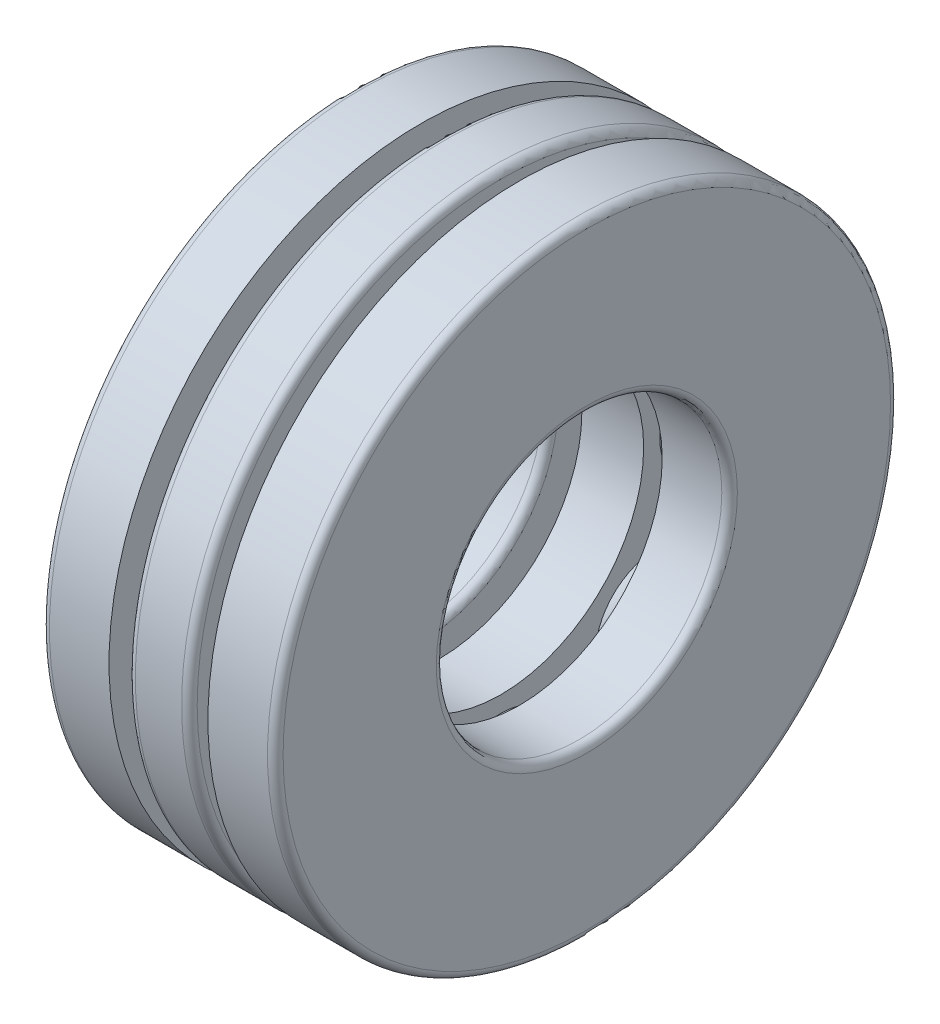
ISO-10303-21;
HEADER;
FILE_DESCRIPTION(('STEP AP214'),'2;1');
FILE_NAME('part.step','',(''),(''),'','','');
FILE_SCHEMA(('AUTOMOTIVE_DESIGN { 1 0 10303 214 1 1 1 1 }'));
ENDSEC;
DATA;
#1=APPLICATION_CONTEXT('core data for automotive mechanical design processes');
#2=APPLICATION_PROTOCOL_DEFINITION('international standard','automotive_design',2000,#1);
#3=PRODUCT_CONTEXT('',#1,'mechanical');
#4=PRODUCT('Part','Part','',(#3));
#5=PRODUCT_RELATED_PRODUCT_CATEGORY('part','',(#4));
#6=PRODUCT_DEFINITION_FORMATION('','',#4);
#7=PRODUCT_DEFINITION_CONTEXT('part definition',#1,'design');
#8=PRODUCT_DEFINITION('design','',#6,#7);
#9=PRODUCT_DEFINITION_SHAPE('','',#8);
#10=(LENGTH_UNIT() NAMED_UNIT(*) SI_UNIT(.MILLI.,.METRE.));
#11=(NAMED_UNIT(*) PLANE_ANGLE_UNIT() SI_UNIT($,.RADIAN.));
#12=(NAMED_UNIT(*) SI_UNIT($,.STERADIAN.) SOLID_ANGLE_UNIT());
#13=UNCERTAINTY_MEASURE_WITH_UNIT(LENGTH_MEASURE(1.E-05),#10,'distance_accuracy_value','');
#14=(GEOMETRIC_REPRESENTATION_CONTEXT(3) GLOBAL_UNCERTAINTY_ASSIGNED_CONTEXT((#13)) GLOBAL_UNIT_ASSIGNED_CONTEXT((#10,
#11,#12)) REPRESENTATION_CONTEXT('',''));
#15=CARTESIAN_POINT('',(0.,0.,0.));
#16=DIRECTION('',(0.,0.,1.));
#17=DIRECTION('',(1.,0.,0.));
#18=AXIS2_PLACEMENT_3D('',#15,#16,#17);
#19=CARTESIAN_POINT('',(3.6095,0.,0.));
#20=DIRECTION('',(1.,0.,0.));
#21=DIRECTION('',(0.,0.,-1.));
#22=AXIS2_PLACEMENT_3D('',#19,#20,#21);
#23=TOROIDAL_SURFACE('',#22,11.7,0.3);
#24=CARTESIAN_POINT('',(3.3095,0.,0.));
#25=DIRECTION('',(1.,0.,0.));
#26=DIRECTION('',(0.,0.,-1.));
#27=AXIS2_PLACEMENT_3D('',#24,#25,#26);
#28=CIRCLE('',#27,11.7);
#29=CARTESIAN_POINT('',(3.3095,0.,-11.7));
#30=VERTEX_POINT('',#29);
#31=EDGE_CURVE('P0_E21',#30,#30,#28,.T.);
#32=ORIENTED_EDGE('',*,*,#31,.T.);
#33=EDGE_LOOP('',(#32));
#34=FACE_BOUND('',#33,.T.);
#35=CARTESIAN_POINT('',(3.6095,0.,0.));
#36=DIRECTION('',(1.,0.,0.));
#37=DIRECTION('',(0.,0.,-1.));
#38=AXIS2_PLACEMENT_3D('',#35,#36,#37);
#39=CIRCLE('',#38,12.);
#40=CARTESIAN_POINT('',(3.6095,0.,-12.));
#41=VERTEX_POINT('',#40);
#42=EDGE_CURVE('P0_E69',#41,#41,#39,.T.);
#43=ORIENTED_EDGE('',*,*,#42,.F.);
#44=EDGE_LOOP('',(#43));
#45=FACE_BOUND('',#44,.T.);
#46=ADVANCED_FACE('P0_F14',(#34,#45),#23,.T.);
#47=CARTESIAN_POINT('',(3.3095,11.7,0.));
#48=DIRECTION('',(-1.,0.,0.));
#49=DIRECTION('',(0.,0.,1.));
#50=AXIS2_PLACEMENT_3D('',#47,#48,#49);
#51=PLANE('',#50);
#52=CARTESIAN_POINT('',(3.3095,0.,0.));
#53=DIRECTION('',(1.,0.,0.));
#54=DIRECTION('',(0.,0.,-1.));
#55=AXIS2_PLACEMENT_3D('',#52,#53,#54);
#56=CIRCLE('',#55,5.5);
#57=CARTESIAN_POINT('',(3.3095,0.,-5.5));
#58=VERTEX_POINT('',#57);
#59=EDGE_CURVE('P0_E26',#58,#58,#56,.T.);
#60=ORIENTED_EDGE('',*,*,#59,.T.);
#61=EDGE_LOOP('',(#60));
#62=FACE_BOUND('',#61,.T.);
#63=CARTESIAN_POINT('',(3.3095,8.5,0.));
#64=DIRECTION('',(-1.,0.,0.));
#65=DIRECTION('',(0.,0.,1.));
#66=AXIS2_PLACEMENT_3D('',#63,#64,#65);
#67=CIRCLE('',#66,2.381);
#68=CARTESIAN_POINT('',(3.3095,8.5,2.381));
#69=VERTEX_POINT('',#68);
#70=EDGE_CURVE('P0_E66',#69,#69,#67,.F.);
#71=ORIENTED_EDGE('',*,*,#70,.T.);
#72=EDGE_LOOP('',(#71));
#73=FACE_BOUND('',#72,.T.);
#74=CARTESIAN_POINT('',(3.3095,0.,8.5));
#75=DIRECTION('',(-1.,0.,0.));
#76=DIRECTION('',(0.,0.,1.));
#77=AXIS2_PLACEMENT_3D('',#74,#75,#76);
#78=CIRCLE('',#77,2.381);
#79=CARTESIAN_POINT('',(3.3095,0.,10.881));
#80=VERTEX_POINT('',#79);
#81=EDGE_CURVE('P0_E63',#80,#80,#78,.F.);
#82=ORIENTED_EDGE('',*,*,#81,.T.);
#83=EDGE_LOOP('',(#82));
#84=FACE_BOUND('',#83,.T.);
#85=CARTESIAN_POINT('',(3.3095,-6.01040764008566,6.01040764008566));
#86=DIRECTION('',(-1.,0.,0.));
#87=DIRECTION('',(0.,0.,1.));
#88=AXIS2_PLACEMENT_3D('',#85,#86,#87);
#89=CIRCLE('',#88,2.381);
#90=CARTESIAN_POINT('',(3.3095,-6.01040764008566,8.39140764008566));
#91=VERTEX_POINT('',#90);
#92=EDGE_CURVE('P0_E51',#91,#91,#89,.F.);
#93=ORIENTED_EDGE('',*,*,#92,.T.);
#94=EDGE_LOOP('',(#93));
#95=FACE_BOUND('',#94,.T.);
#96=CARTESIAN_POINT('',(3.3095,-8.5,0.));
#97=DIRECTION('',(-1.,0.,0.));
#98=DIRECTION('',(0.,0.,1.));
#99=AXIS2_PLACEMENT_3D('',#96,#97,#98);
#100=CIRCLE('',#99,2.381);
#101=CARTESIAN_POINT('',(3.3095,-8.5,2.381));
#102=VERTEX_POINT('',#101);
#103=EDGE_CURVE('P0_E48',#102,#102,#100,.F.);
#104=ORIENTED_EDGE('',*,*,#103,.T.);
#105=EDGE_LOOP('',(#104));
#106=FACE_BOUND('',#105,.T.);
#107=CARTESIAN_POINT('',(3.3095,-6.01040764008566,-6.01040764008566));
#108=DIRECTION('',(-1.,0.,0.));
#109=DIRECTION('',(0.,0.,1.));
#110=AXIS2_PLACEMENT_3D('',#107,#108,#109);
#111=CIRCLE('',#110,2.381);
#112=CARTESIAN_POINT('',(3.3095,-6.01040764008566,-3.62940764008566));
#113=VERTEX_POINT('',#112);
#114=EDGE_CURVE('P0_E45',#113,#113,#111,.F.);
#115=ORIENTED_EDGE('',*,*,#114,.T.);
#116=EDGE_LOOP('',(#115));
#117=FACE_BOUND('',#116,.T.);
#118=CARTESIAN_POINT('',(3.3095,0.,-8.5));
#119=DIRECTION('',(-1.,0.,0.));
#120=DIRECTION('',(0.,0.,1.));
#121=AXIS2_PLACEMENT_3D('',#118,#119,#120);
#122=CIRCLE('',#121,2.381);
#123=CARTESIAN_POINT('',(3.3095,0.,-6.119));
#124=VERTEX_POINT('',#123);
#125=EDGE_CURVE('P0_E41',#124,#124,#122,.F.);
#126=ORIENTED_EDGE('',*,*,#125,.T.);
#127=EDGE_LOOP('',(#126));
#128=FACE_BOUND('',#127,.T.);
#129=CARTESIAN_POINT('',(3.3095,6.01040764008566,-6.01040764008566));
#130=DIRECTION('',(-1.,0.,0.));
#131=DIRECTION('',(0.,0.,1.));
#132=AXIS2_PLACEMENT_3D('',#129,#130,#131);
#133=CIRCLE('',#132,2.381);
#134=CARTESIAN_POINT('',(3.3095,6.01040764008566,-3.62940764008566));
#135=VERTEX_POINT('',#134);
#136=EDGE_CURVE('P0_E37',#135,#135,#133,.F.);
#137=ORIENTED_EDGE('',*,*,#136,.T.);
#138=EDGE_LOOP('',(#137));
#139=FACE_BOUND('',#138,.T.);
#140=CARTESIAN_POINT('',(3.3095,6.01040764008565,6.01040764008565));
#141=DIRECTION('',(-1.,0.,0.));
#142=DIRECTION('',(0.,0.,1.));
#143=AXIS2_PLACEMENT_3D('',#140,#141,#142);
#144=CIRCLE('',#143,2.381);
#145=CARTESIAN_POINT('',(3.3095,6.01040764008565,8.39140764008565));
#146=VERTEX_POINT('',#145);
#147=EDGE_CURVE('P0_E33',#146,#146,#144,.F.);
#148=ORIENTED_EDGE('',*,*,#147,.T.);
#149=EDGE_LOOP('',(#148));
#150=FACE_BOUND('',#149,.T.);
#151=ORIENTED_EDGE('',*,*,#31,.F.);
#152=EDGE_LOOP('',(#151));
#153=FACE_BOUND('',#152,.T.);
#154=ADVANCED_FACE('P0_F83',(#62,#73,#84,#95,#106,#117,#128,#139,#150,#153),#51,.T.);
#155=CARTESIAN_POINT('',(5.6905,0.,0.));
#156=DIRECTION('',(1.,0.,0.));
#157=DIRECTION('',(0.,0.,-1.));
#158=AXIS2_PLACEMENT_3D('',#155,#156,#157);
#159=CYLINDRICAL_SURFACE('',#158,5.5);
#160=CARTESIAN_POINT('',(5.6905,0.,0.));
#161=DIRECTION('',(1.,0.,0.));
#162=DIRECTION('',(0.,0.,-1.));
#163=AXIS2_PLACEMENT_3D('',#160,#161,#162);
#164=CIRCLE('',#163,5.5);
#165=CARTESIAN_POINT('',(5.6905,0.,-5.5));
#166=VERTEX_POINT('',#165);
#167=EDGE_CURVE('P0_E78',#166,#166,#164,.T.);
#168=ORIENTED_EDGE('',*,*,#167,.T.);
#169=EDGE_LOOP('',(#168));
#170=FACE_BOUND('',#169,.T.);
#171=ORIENTED_EDGE('',*,*,#59,.F.);
#172=EDGE_LOOP('',(#171));
#173=FACE_BOUND('',#172,.T.);
#174=ADVANCED_FACE('P0_F86',(#170,#173),#159,.F.);
#175=CARTESIAN_POINT('',(5.6905,5.5,0.));
#176=DIRECTION('',(1.,0.,0.));
#177=DIRECTION('',(0.,0.,-1.));
#178=AXIS2_PLACEMENT_3D('',#175,#176,#177);
#179=PLANE('',#178);
#180=CARTESIAN_POINT('',(5.6905,0.,0.));
#181=DIRECTION('',(1.,0.,0.));
#182=DIRECTION('',(0.,0.,-1.));
#183=AXIS2_PLACEMENT_3D('',#180,#181,#182);
#184=CIRCLE('',#183,11.7);
#185=CARTESIAN_POINT('',(5.6905,0.,-11.7));
#186=VERTEX_POINT('',#185);
#187=EDGE_CURVE('P0_E75',#186,#186,#184,.T.);
#188=ORIENTED_EDGE('',*,*,#187,.T.);
#189=EDGE_LOOP('',(#188));
#190=FACE_BOUND('',#189,.T.);
#191=CARTESIAN_POINT('',(5.6905,8.5,0.));
#192=DIRECTION('',(1.,0.,0.));
#193=DIRECTION('',(0.,0.,-1.));
#194=AXIS2_PLACEMENT_3D('',#191,#192,#193);
#195=CIRCLE('',#194,2.381);
#196=CARTESIAN_POINT('',(5.6905,8.5,-2.381));
#197=VERTEX_POINT('',#196);
#198=EDGE_CURVE('P0_E10',#197,#197,#195,.F.);
#199=ORIENTED_EDGE('',*,*,#198,.T.);
#200=EDGE_LOOP('',(#199));
#201=FACE_BOUND('',#200,.T.);
#202=CARTESIAN_POINT('',(5.6905,0.,8.5));
#203=DIRECTION('',(1.,0.,0.));
#204=DIRECTION('',(0.,0.,-1.));
#205=AXIS2_PLACEMENT_3D('',#202,#203,#204);
#206=CIRCLE('',#205,2.381);
#207=CARTESIAN_POINT('',(5.6905,0.,6.119));
#208=VERTEX_POINT('',#207);
#209=EDGE_CURVE('P0_E17',#208,#208,#206,.F.);
#210=ORIENTED_EDGE('',*,*,#209,.T.);
#211=EDGE_LOOP('',(#210));
#212=FACE_BOUND('',#211,.T.);
#213=CARTESIAN_POINT('',(5.6905,-6.01040764008566,6.01040764008566));
#214=DIRECTION('',(1.,0.,0.));
#215=DIRECTION('',(0.,0.,-1.));
#216=AXIS2_PLACEMENT_3D('',#213,#214,#215);
#217=CIRCLE('',#216,2.381);
#218=CARTESIAN_POINT('',(5.6905,-6.01040764008566,3.62940764008566));
#219=VERTEX_POINT('',#218);
#220=EDGE_CURVE('P0_E49',#219,#219,#217,.F.);
#221=ORIENTED_EDGE('',*,*,#220,.T.);
#222=EDGE_LOOP('',(#221));
#223=FACE_BOUND('',#222,.T.);
#224=CARTESIAN_POINT('',(5.6905,-8.5,0.));
#225=DIRECTION('',(1.,0.,0.));
#226=DIRECTION('',(0.,0.,-1.));
#227=AXIS2_PLACEMENT_3D('',#224,#225,#226);
#228=CIRCLE('',#227,2.381);
#229=CARTESIAN_POINT('',(5.6905,-8.5,-2.381));
#230=VERTEX_POINT('',#229);
#231=EDGE_CURVE('P0_E46',#230,#230,#228,.F.);
#232=ORIENTED_EDGE('',*,*,#231,.T.);
#233=EDGE_LOOP('',(#232));
#234=FACE_BOUND('',#233,.T.);
#235=CARTESIAN_POINT('',(5.6905,-6.01040764008566,-6.01040764008566));
#236=DIRECTION('',(1.,0.,0.));
#237=DIRECTION('',(0.,0.,-1.));
#238=AXIS2_PLACEMENT_3D('',#235,#236,#237);
#239=CIRCLE('',#238,2.381);
#240=CARTESIAN_POINT('',(5.6905,-6.01040764008566,-8.39140764008566));
#241=VERTEX_POINT('',#240);
#242=EDGE_CURVE('P0_E42',#241,#241,#239,.F.);
#243=ORIENTED_EDGE('',*,*,#242,.T.);
#244=EDGE_LOOP('',(#243));
#245=FACE_BOUND('',#244,.T.);
#246=CARTESIAN_POINT('',(5.6905,0.,-8.5));
#247=DIRECTION('',(1.,0.,0.));
#248=DIRECTION('',(0.,0.,-1.));
#249=AXIS2_PLACEMENT_3D('',#246,#247,#248);
#250=CIRCLE('',#249,2.381);
#251=CARTESIAN_POINT('',(5.6905,0.,-10.881));
#252=VERTEX_POINT('',#251);
#253=EDGE_CURVE('P0_E38',#252,#252,#250,.F.);
#254=ORIENTED_EDGE('',*,*,#253,.T.);
#255=EDGE_LOOP('',(#254));
#256=FACE_BOUND('',#255,.T.);
#257=CARTESIAN_POINT('',(5.6905,6.01040764008566,-6.01040764008566));
#258=DIRECTION('',(1.,0.,0.));
#259=DIRECTION('',(0.,0.,-1.));
#260=AXIS2_PLACEMENT_3D('',#257,#258,#259);
#261=CIRCLE('',#260,2.381);
#262=CARTESIAN_POINT('',(5.6905,6.01040764008566,-8.39140764008566));
#263=VERTEX_POINT('',#262);
#264=EDGE_CURVE('P0_E34',#263,#263,#261,.F.);
#265=ORIENTED_EDGE('',*,*,#264,.T.);
#266=EDGE_LOOP('',(#265));
#267=FACE_BOUND('',#266,.T.);
#268=CARTESIAN_POINT('',(5.6905,6.01040764008565,6.01040764008565));
#269=DIRECTION('',(1.,0.,0.));
#270=DIRECTION('',(0.,0.,-1.));
#271=AXIS2_PLACEMENT_3D('',#268,#269,#270);
#272=CIRCLE('',#271,2.381);
#273=CARTESIAN_POINT('',(5.6905,6.01040764008565,3.62940764008565));
#274=VERTEX_POINT('',#273);
#275=EDGE_CURVE('P0_E30',#274,#274,#272,.F.);
#276=ORIENTED_EDGE('',*,*,#275,.T.);
#277=EDGE_LOOP('',(#276));
#278=FACE_BOUND('',#277,.T.);
#279=ORIENTED_EDGE('',*,*,#167,.F.);
#280=EDGE_LOOP('',(#279));
#281=FACE_BOUND('',#280,.T.);
#282=ADVANCED_FACE('P0_F88',(#190,#201,#212,#223,#234,#245,#256,#267,#278,#281),#179,.T.);
#283=CARTESIAN_POINT('',(5.3905,0.,0.));
#284=DIRECTION('',(1.,0.,0.));
#285=DIRECTION('',(0.,0.,-1.));
#286=AXIS2_PLACEMENT_3D('',#283,#284,#285);
#287=TOROIDAL_SURFACE('',#286,11.7,0.300000000000003);
#288=CARTESIAN_POINT('',(5.3905,0.,0.));
#289=DIRECTION('',(1.,0.,0.));
#290=DIRECTION('',(0.,0.,-1.));
#291=AXIS2_PLACEMENT_3D('',#288,#289,#290);
#292=CIRCLE('',#291,12.);
#293=CARTESIAN_POINT('',(5.3905,0.,-12.));
#294=VERTEX_POINT('',#293);
#295=EDGE_CURVE('P0_E72',#294,#294,#292,.T.);
#296=ORIENTED_EDGE('',*,*,#295,.T.);
#297=EDGE_LOOP('',(#296));
#298=FACE_BOUND('',#297,.T.);
#299=ORIENTED_EDGE('',*,*,#187,.F.);
#300=EDGE_LOOP('',(#299));
#301=FACE_BOUND('',#300,.T.);
#302=ADVANCED_FACE('P0_F96',(#298,#301),#287,.T.);
#303=CARTESIAN_POINT('',(5.6905,0.,0.));
#304=DIRECTION('',(1.,0.,0.));
#305=DIRECTION('',(0.,0.,-1.));
#306=AXIS2_PLACEMENT_3D('',#303,#304,#305);
#307=CYLINDRICAL_SURFACE('',#306,12.);
#308=ORIENTED_EDGE('',*,*,#42,.T.);
#309=EDGE_LOOP('',(#308));
#310=FACE_BOUND('',#309,.T.);
#311=ORIENTED_EDGE('',*,*,#295,.F.);
#312=EDGE_LOOP('',(#311));
#313=FACE_BOUND('',#312,.T.);
#314=ADVANCED_FACE('P0_F107',(#310,#313),#307,.T.);
#315=CARTESIAN_POINT('',(9.,8.5,0.));
#316=DIRECTION('',(-1.,0.,0.));
#317=DIRECTION('',(0.,0.,1.));
#318=AXIS2_PLACEMENT_3D('',#315,#316,#317);
#319=CYLINDRICAL_SURFACE('',#318,2.381);
#320=ORIENTED_EDGE('',*,*,#70,.F.);
#321=EDGE_LOOP('',(#320));
#322=FACE_BOUND('',#321,.T.);
#323=ORIENTED_EDGE('',*,*,#198,.F.);
#324=EDGE_LOOP('',(#323));
#325=FACE_BOUND('',#324,.T.);
#326=ADVANCED_FACE('P0_F110',(#322,#325),#319,.F.);
#327=CARTESIAN_POINT('',(9.,6.01040764008565,6.01040764008565));
#328=DIRECTION('',(-1.,0.,0.));
#329=DIRECTION('',(0.,0.,1.));
#330=AXIS2_PLACEMENT_3D('',#327,#328,#329);
#331=CYLINDRICAL_SURFACE('',#330,2.381);
#332=ORIENTED_EDGE('',*,*,#147,.F.);
#333=EDGE_LOOP('',(#332));
#334=FACE_BOUND('',#333,.T.);
#335=ORIENTED_EDGE('',*,*,#275,.F.);
#336=EDGE_LOOP('',(#335));
#337=FACE_BOUND('',#336,.T.);
#338=ADVANCED_FACE('P0_F134',(#334,#337),#331,.F.);
#339=CARTESIAN_POINT('',(9.,6.01040764008566,-6.01040764008566));
#340=DIRECTION('',(-1.,0.,0.));
#341=DIRECTION('',(0.,0.,1.));
#342=AXIS2_PLACEMENT_3D('',#339,#340,#341);
#343=CYLINDRICAL_SURFACE('',#342,2.381);
#344=ORIENTED_EDGE('',*,*,#136,.F.);
#345=EDGE_LOOP('',(#344));
#346=FACE_BOUND('',#345,.T.);
#347=ORIENTED_EDGE('',*,*,#264,.F.);
#348=EDGE_LOOP('',(#347));
#349=FACE_BOUND('',#348,.T.);
#350=ADVANCED_FACE('P0_F136',(#346,#349),#343,.F.);
#351=CARTESIAN_POINT('',(9.,0.,-8.5));
#352=DIRECTION('',(-1.,0.,0.));
#353=DIRECTION('',(0.,0.,1.));
#354=AXIS2_PLACEMENT_3D('',#351,#352,#353);
#355=CYLINDRICAL_SURFACE('',#354,2.381);
#356=ORIENTED_EDGE('',*,*,#125,.F.);
#357=EDGE_LOOP('',(#356));
#358=FACE_BOUND('',#357,.T.);
#359=ORIENTED_EDGE('',*,*,#253,.F.);
#360=EDGE_LOOP('',(#359));
#361=FACE_BOUND('',#360,.T.);
#362=ADVANCED_FACE('P0_F143',(#358,#361),#355,.F.);
#363=CARTESIAN_POINT('',(9.,-6.01040764008566,-6.01040764008566));
#364=DIRECTION('',(-1.,0.,0.));
#365=DIRECTION('',(0.,0.,1.));
#366=AXIS2_PLACEMENT_3D('',#363,#364,#365);
#367=CYLINDRICAL_SURFACE('',#366,2.381);
#368=ORIENTED_EDGE('',*,*,#114,.F.);
#369=EDGE_LOOP('',(#368));
#370=FACE_BOUND('',#369,.T.);
#371=ORIENTED_EDGE('',*,*,#242,.F.);
#372=EDGE_LOOP('',(#371));
#373=FACE_BOUND('',#372,.T.);
#374=ADVANCED_FACE('P0_F150',(#370,#373),#367,.F.);
#375=CARTESIAN_POINT('',(9.,-8.5,0.));
#376=DIRECTION('',(-1.,0.,0.));
#377=DIRECTION('',(0.,0.,1.));
#378=AXIS2_PLACEMENT_3D('',#375,#376,#377);
#379=CYLINDRICAL_SURFACE('',#378,2.381);
#380=ORIENTED_EDGE('',*,*,#103,.F.);
#381=EDGE_LOOP('',(#380));
#382=FACE_BOUND('',#381,.T.);
#383=ORIENTED_EDGE('',*,*,#231,.F.);
#384=EDGE_LOOP('',(#383));
#385=FACE_BOUND('',#384,.T.);
#386=ADVANCED_FACE('P0_F153',(#382,#385),#379,.F.);
#387=CARTESIAN_POINT('',(9.,-6.01040764008566,6.01040764008566));
#388=DIRECTION('',(-1.,0.,0.));
#389=DIRECTION('',(0.,0.,1.));
#390=AXIS2_PLACEMENT_3D('',#387,#388,#389);
#391=CYLINDRICAL_SURFACE('',#390,2.381);
#392=ORIENTED_EDGE('',*,*,#92,.F.);
#393=EDGE_LOOP('',(#392));
#394=FACE_BOUND('',#393,.T.);
#395=ORIENTED_EDGE('',*,*,#220,.F.);
#396=EDGE_LOOP('',(#395));
#397=FACE_BOUND('',#396,.T.);
#398=ADVANCED_FACE('P0_F157',(#394,#397),#391,.F.);
#399=CARTESIAN_POINT('',(9.,0.,8.5));
#400=DIRECTION('',(-1.,0.,0.));
#401=DIRECTION('',(0.,0.,1.));
#402=AXIS2_PLACEMENT_3D('',#399,#400,#401);
#403=CYLINDRICAL_SURFACE('',#402,2.381);
#404=ORIENTED_EDGE('',*,*,#81,.F.);
#405=EDGE_LOOP('',(#404));
#406=FACE_BOUND('',#405,.T.);
#407=ORIENTED_EDGE('',*,*,#209,.F.);
#408=EDGE_LOOP('',(#407));
#409=FACE_BOUND('',#408,.T.);
#410=ADVANCED_FACE('P0_F161',(#406,#409),#403,.F.);
#411=CLOSED_SHELL('',(#46,#154,#174,#282,#302,#314,#326,#338,#350,#362,#374,#386,#398,#410));
#412=MANIFOLD_SOLID_BREP('P0_B1',#411);
#413=CARTESIAN_POINT('',(0.,11.7,0.));
#414=DIRECTION('',(-1.,0.,0.));
#415=DIRECTION('',(0.,0.,1.));
#416=AXIS2_PLACEMENT_3D('',#413,#414,#415);
#417=PLANE('',#416);
#418=CARTESIAN_POINT('',(0.,0.,0.));
#419=DIRECTION('',(1.,0.,0.));
#420=DIRECTION('',(0.,0.,-1.));
#421=AXIS2_PLACEMENT_3D('',#418,#419,#420);
#422=CIRCLE('',#421,5.3);
#423=CARTESIAN_POINT('',(0.,0.,-5.3));
#424=VERTEX_POINT('',#423);
#425=EDGE_CURVE('P1_E10',#424,#424,#422,.T.);
#426=ORIENTED_EDGE('',*,*,#425,.T.);
#427=EDGE_LOOP('',(#426));
#428=FACE_BOUND('',#427,.T.);
#429=CARTESIAN_POINT('',(0.,0.,0.));
#430=DIRECTION('',(1.,0.,0.));
#431=DIRECTION('',(0.,0.,-1.));
#432=AXIS2_PLACEMENT_3D('',#429,#430,#431);
#433=CIRCLE('',#432,11.7);
#434=CARTESIAN_POINT('',(0.,0.,-11.7));
#435=VERTEX_POINT('',#434);
#436=EDGE_CURVE('P1_E45',#435,#435,#433,.T.);
#437=ORIENTED_EDGE('',*,*,#436,.F.);
#438=EDGE_LOOP('',(#437));
#439=FACE_BOUND('',#438,.T.);
#440=ADVANCED_FACE('P1_F14',(#428,#439),#417,.T.);
#441=CARTESIAN_POINT('',(0.3,0.,0.));
#442=DIRECTION('',(1.,0.,0.));
#443=DIRECTION('',(0.,0.,-1.));
#444=AXIS2_PLACEMENT_3D('',#441,#442,#443);
#445=TOROIDAL_SURFACE('',#444,5.3,0.3);
#446=CARTESIAN_POINT('',(0.3,0.,0.));
#447=DIRECTION('',(1.,0.,0.));
#448=DIRECTION('',(0.,0.,-1.));
#449=AXIS2_PLACEMENT_3D('',#446,#447,#448);
#450=CIRCLE('',#449,5.);
#451=CARTESIAN_POINT('',(0.3,0.,-5.));
#452=VERTEX_POINT('',#451);
#453=EDGE_CURVE('P1_E20',#452,#452,#450,.T.);
#454=ORIENTED_EDGE('',*,*,#453,.T.);
#455=EDGE_LOOP('',(#454));
#456=FACE_BOUND('',#455,.T.);
#457=ORIENTED_EDGE('',*,*,#425,.F.);
#458=EDGE_LOOP('',(#457));
#459=FACE_BOUND('',#458,.T.);
#460=ADVANCED_FACE('P1_F53',(#456,#459),#445,.T.);
#461=CARTESIAN_POINT('',(2.5952,0.,0.));
#462=DIRECTION('',(1.,0.,0.));
#463=DIRECTION('',(0.,0.,-1.));
#464=AXIS2_PLACEMENT_3D('',#461,#462,#463);
#465=CYLINDRICAL_SURFACE('',#464,5.);
#466=CARTESIAN_POINT('',(2.2952,0.,0.));
#467=DIRECTION('',(1.,0.,0.));
#468=DIRECTION('',(0.,0.,-1.));
#469=AXIS2_PLACEMENT_3D('',#466,#467,#468);
#470=CIRCLE('',#469,5.);
#471=CARTESIAN_POINT('',(2.2952,0.,-5.));
#472=VERTEX_POINT('',#471);
#473=EDGE_CURVE('P1_E24',#472,#472,#470,.T.);
#474=ORIENTED_EDGE('',*,*,#473,.T.);
#475=EDGE_LOOP('',(#474));
#476=FACE_BOUND('',#475,.T.);
#477=ORIENTED_EDGE('',*,*,#453,.F.);
#478=EDGE_LOOP('',(#477));
#479=FACE_BOUND('',#478,.T.);
#480=ADVANCED_FACE('P1_F58',(#476,#479),#465,.F.);
#481=CARTESIAN_POINT('',(2.2952,0.,0.));
#482=DIRECTION('',(1.,0.,0.));
#483=DIRECTION('',(0.,0.,-1.));
#484=AXIS2_PLACEMENT_3D('',#481,#482,#483);
#485=TOROIDAL_SURFACE('',#484,5.3,0.3);
#486=CARTESIAN_POINT('',(2.5952,0.,0.));
#487=DIRECTION('',(1.,0.,0.));
#488=DIRECTION('',(0.,0.,-1.));
#489=AXIS2_PLACEMENT_3D('',#486,#487,#488);
#490=CIRCLE('',#489,5.3);
#491=CARTESIAN_POINT('',(2.5952,0.,-5.3));
#492=VERTEX_POINT('',#491);
#493=EDGE_CURVE('P1_E28',#492,#492,#490,.T.);
#494=ORIENTED_EDGE('',*,*,#493,.T.);
#495=EDGE_LOOP('',(#494));
#496=FACE_BOUND('',#495,.T.);
#497=ORIENTED_EDGE('',*,*,#473,.F.);
#498=EDGE_LOOP('',(#497));
#499=FACE_BOUND('',#498,.T.);
#500=ADVANCED_FACE('P1_F62',(#496,#499),#485,.T.);
#501=CARTESIAN_POINT('',(2.5952,5.3,0.));
#502=DIRECTION('',(1.,0.,0.));
#503=DIRECTION('',(0.,0.,-1.));
#504=AXIS2_PLACEMENT_3D('',#501,#502,#503);
#505=PLANE('',#504);
#506=CARTESIAN_POINT('',(2.5952,0.,0.));
#507=DIRECTION('',(1.,0.,0.));
#508=DIRECTION('',(0.,0.,-1.));
#509=AXIS2_PLACEMENT_3D('',#506,#507,#508);
#510=CIRCLE('',#509,7.0714);
#511=CARTESIAN_POINT('',(2.5952,0.,-7.0714));
#512=VERTEX_POINT('',#511);
#513=EDGE_CURVE('P1_E33',#512,#512,#510,.T.);
#514=ORIENTED_EDGE('',*,*,#513,.T.);
#515=EDGE_LOOP('',(#514));
#516=FACE_BOUND('',#515,.T.);
#517=ORIENTED_EDGE('',*,*,#493,.F.);
#518=EDGE_LOOP('',(#517));
#519=FACE_BOUND('',#518,.T.);
#520=ADVANCED_FACE('P1_F69',(#516,#519),#505,.T.);
#521=CARTESIAN_POINT('',(4.5,0.,0.));
#522=DIRECTION('',(1.,0.,0.));
#523=DIRECTION('',(0.,0.,-1.));
#524=AXIS2_PLACEMENT_3D('',#521,#522,#523);
#525=TOROIDAL_SURFACE('',#524,8.5,2.381);
#526=ORIENTED_EDGE('',*,*,#513,.F.);
#527=EDGE_LOOP('',(#526));
#528=FACE_BOUND('',#527,.T.);
#529=CARTESIAN_POINT('',(2.5952,0.,0.));
#530=DIRECTION('',(1.,0.,0.));
#531=DIRECTION('',(0.,0.,-1.));
#532=AXIS2_PLACEMENT_3D('',#529,#530,#531);
#533=CIRCLE('',#532,9.9286);
#534=CARTESIAN_POINT('',(2.5952,0.,-9.9286));
#535=VERTEX_POINT('',#534);
#536=EDGE_CURVE('P1_E36',#535,#535,#533,.T.);
#537=ORIENTED_EDGE('',*,*,#536,.T.);
#538=EDGE_LOOP('',(#537));
#539=FACE_BOUND('',#538,.T.);
#540=ADVANCED_FACE('P1_F73',(#528,#539),#525,.F.);
#541=CARTESIAN_POINT('',(2.5952,9.9286,0.));
#542=DIRECTION('',(1.,0.,0.));
#543=DIRECTION('',(0.,0.,-1.));
#544=AXIS2_PLACEMENT_3D('',#541,#542,#543);
#545=PLANE('',#544);
#546=CARTESIAN_POINT('',(2.5952,0.,0.));
#547=DIRECTION('',(1.,0.,0.));
#548=DIRECTION('',(0.,0.,-1.));
#549=AXIS2_PLACEMENT_3D('',#546,#547,#548);
#550=CIRCLE('',#549,12.);
#551=CARTESIAN_POINT('',(2.5952,0.,-12.));
#552=VERTEX_POINT('',#551);
#553=EDGE_CURVE('P1_E39',#552,#552,#550,.T.);
#554=ORIENTED_EDGE('',*,*,#553,.T.);
#555=EDGE_LOOP('',(#554));
#556=FACE_BOUND('',#555,.T.);
#557=ORIENTED_EDGE('',*,*,#536,.F.);
#558=EDGE_LOOP('',(#557));
#559=FACE_BOUND('',#558,.T.);
#560=ADVANCED_FACE('P1_F77',(#556,#559),#545,.T.);
#561=CARTESIAN_POINT('',(2.5952,0.,0.));
#562=DIRECTION('',(1.,0.,0.));
#563=DIRECTION('',(0.,0.,-1.));
#564=AXIS2_PLACEMENT_3D('',#561,#562,#563);
#565=CYLINDRICAL_SURFACE('',#564,12.);
#566=CARTESIAN_POINT('',(0.3,0.,0.));
#567=DIRECTION('',(1.,0.,0.));
#568=DIRECTION('',(0.,0.,-1.));
#569=AXIS2_PLACEMENT_3D('',#566,#567,#568);
#570=CIRCLE('',#569,12.);
#571=CARTESIAN_POINT('',(0.3,0.,-12.));
#572=VERTEX_POINT('',#571);
#573=EDGE_CURVE('P1_E42',#572,#572,#570,.T.);
#574=ORIENTED_EDGE('',*,*,#573,.T.);
#575=EDGE_LOOP('',(#574));
#576=FACE_BOUND('',#575,.T.);
#577=ORIENTED_EDGE('',*,*,#553,.F.);
#578=EDGE_LOOP('',(#577));
#579=FACE_BOUND('',#578,.T.);
#580=ADVANCED_FACE('P1_F81',(#576,#579),#565,.T.);
#581=CARTESIAN_POINT('',(0.3,0.,0.));
#582=DIRECTION('',(1.,0.,0.));
#583=DIRECTION('',(0.,0.,-1.));
#584=AXIS2_PLACEMENT_3D('',#581,#582,#583);
#585=TOROIDAL_SURFACE('',#584,11.7,0.3);
#586=ORIENTED_EDGE('',*,*,#436,.T.);
#587=EDGE_LOOP('',(#586));
#588=FACE_BOUND('',#587,.T.);
#589=ORIENTED_EDGE('',*,*,#573,.F.);
#590=EDGE_LOOP('',(#589));
#591=FACE_BOUND('',#590,.T.);
#592=ADVANCED_FACE('P1_F49',(#588,#591),#585,.T.);
#593=CLOSED_SHELL('',(#440,#460,#480,#500,#520,#540,#560,#580,#592));
#594=MANIFOLD_SOLID_BREP('P1_B1',#593);
#595=CARTESIAN_POINT('',(4.5,0.,0.));
#596=DIRECTION('',(1.,0.,0.));
#597=DIRECTION('',(0.,0.,-1.));
#598=AXIS2_PLACEMENT_3D('',#595,#596,#597);
#599=TOROIDAL_SURFACE('',#598,8.5,2.381);
#600=CARTESIAN_POINT('',(6.4048,0.,0.));
#601=DIRECTION('',(1.,0.,0.));
#602=DIRECTION('',(0.,0.,-1.));
#603=AXIS2_PLACEMENT_3D('',#600,#601,#602);
#604=CIRCLE('',#603,9.9286);
#605=CARTESIAN_POINT('',(6.4048,0.,-9.9286));
#606=VERTEX_POINT('',#605);
#607=EDGE_CURVE('P2_E10',#606,#606,#604,.T.);
#608=ORIENTED_EDGE('',*,*,#607,.F.);
#609=EDGE_LOOP('',(#608));
#610=FACE_BOUND('',#609,.T.);
#611=CARTESIAN_POINT('',(6.4048,0.,0.));
#612=DIRECTION('',(1.,0.,0.));
#613=DIRECTION('',(0.,0.,-1.));
#614=AXIS2_PLACEMENT_3D('',#611,#612,#613);
#615=CIRCLE('',#614,7.0714);
#616=CARTESIAN_POINT('',(6.4048,0.,-7.0714));
#617=VERTEX_POINT('',#616);
#618=EDGE_CURVE('P2_E42',#617,#617,#615,.T.);
#619=ORIENTED_EDGE('',*,*,#618,.T.);
#620=EDGE_LOOP('',(#619));
#621=FACE_BOUND('',#620,.T.);
#622=ADVANCED_FACE('P2_F14',(#610,#621),#599,.F.);
#623=CARTESIAN_POINT('',(6.4048,12.,0.));
#624=DIRECTION('',(-1.,0.,0.));
#625=DIRECTION('',(0.,0.,1.));
#626=AXIS2_PLACEMENT_3D('',#623,#624,#625);
#627=PLANE('',#626);
#628=ORIENTED_EDGE('',*,*,#607,.T.);
#629=EDGE_LOOP('',(#628));
#630=FACE_BOUND('',#629,.T.);
#631=CARTESIAN_POINT('',(6.4048,0.,0.));
#632=DIRECTION('',(1.,0.,0.));
#633=DIRECTION('',(0.,0.,-1.));
#634=AXIS2_PLACEMENT_3D('',#631,#632,#633);
#635=CIRCLE('',#634,12.);
#636=CARTESIAN_POINT('',(6.4048,0.,-12.));
#637=VERTEX_POINT('',#636);
#638=EDGE_CURVE('P2_E20',#637,#637,#635,.T.);
#639=ORIENTED_EDGE('',*,*,#638,.F.);
#640=EDGE_LOOP('',(#639));
#641=FACE_BOUND('',#640,.T.);
#642=ADVANCED_FACE('P2_F60',(#630,#641),#627,.T.);
#643=CARTESIAN_POINT('',(8.7,0.,0.));
#644=DIRECTION('',(1.,0.,0.));
#645=DIRECTION('',(0.,0.,-1.));
#646=AXIS2_PLACEMENT_3D('',#643,#644,#645);
#647=CYLINDRICAL_SURFACE('',#646,12.);
#648=ORIENTED_EDGE('',*,*,#638,.T.);
#649=EDGE_LOOP('',(#648));
#650=FACE_BOUND('',#649,.T.);
#651=CARTESIAN_POINT('',(8.7,0.,0.));
#652=DIRECTION('',(1.,0.,0.));
#653=DIRECTION('',(0.,0.,-1.));
#654=AXIS2_PLACEMENT_3D('',#651,#652,#653);
#655=CIRCLE('',#654,12.);
#656=CARTESIAN_POINT('',(8.7,0.,-12.));
#657=VERTEX_POINT('',#656);
#658=EDGE_CURVE('P2_E24',#657,#657,#655,.T.);
#659=ORIENTED_EDGE('',*,*,#658,.F.);
#660=EDGE_LOOP('',(#659));
#661=FACE_BOUND('',#660,.T.);
#662=ADVANCED_FACE('P2_F65',(#650,#661),#647,.T.);
#663=CARTESIAN_POINT('',(8.7,0.,0.));
#664=DIRECTION('',(1.,0.,0.));
#665=DIRECTION('',(0.,0.,-1.));
#666=AXIS2_PLACEMENT_3D('',#663,#664,#665);
#667=TOROIDAL_SURFACE('',#666,11.7,0.300000000000003);
#668=ORIENTED_EDGE('',*,*,#658,.T.);
#669=EDGE_LOOP('',(#668));
#670=FACE_BOUND('',#669,.T.);
#671=CARTESIAN_POINT('',(9.,0.,0.));
#672=DIRECTION('',(1.,0.,0.));
#673=DIRECTION('',(0.,0.,-1.));
#674=AXIS2_PLACEMENT_3D('',#671,#672,#673);
#675=CIRCLE('',#674,11.7);
#676=CARTESIAN_POINT('',(9.,0.,-11.7));
#677=VERTEX_POINT('',#676);
#678=EDGE_CURVE('P2_E28',#677,#677,#675,.T.);
#679=ORIENTED_EDGE('',*,*,#678,.F.);
#680=EDGE_LOOP('',(#679));
#681=FACE_BOUND('',#680,.T.);
#682=ADVANCED_FACE('P2_F69',(#670,#681),#667,.T.);
#683=CARTESIAN_POINT('',(9.,5.8,0.));
#684=DIRECTION('',(1.,0.,0.));
#685=DIRECTION('',(0.,0.,-1.));
#686=AXIS2_PLACEMENT_3D('',#683,#684,#685);
#687=PLANE('',#686);
#688=ORIENTED_EDGE('',*,*,#678,.T.);
#689=EDGE_LOOP('',(#688));
#690=FACE_BOUND('',#689,.T.);
#691=CARTESIAN_POINT('',(9.,0.,0.));
#692=DIRECTION('',(1.,0.,0.));
#693=DIRECTION('',(0.,0.,-1.));
#694=AXIS2_PLACEMENT_3D('',#691,#692,#693);
#695=CIRCLE('',#694,5.8);
#696=CARTESIAN_POINT('',(9.,0.,-5.8));
#697=VERTEX_POINT('',#696);
#698=EDGE_CURVE('P2_E33',#697,#697,#695,.T.);
#699=ORIENTED_EDGE('',*,*,#698,.F.);
#700=EDGE_LOOP('',(#699));
#701=FACE_BOUND('',#700,.T.);
#702=ADVANCED_FACE('P2_F75',(#690,#701),#687,.T.);
#703=CARTESIAN_POINT('',(8.7,0.,0.));
#704=DIRECTION('',(1.,0.,0.));
#705=DIRECTION('',(0.,0.,-1.));
#706=AXIS2_PLACEMENT_3D('',#703,#704,#705);
#707=TOROIDAL_SURFACE('',#706,5.8,0.300000000000003);
#708=ORIENTED_EDGE('',*,*,#698,.T.);
#709=EDGE_LOOP('',(#708));
#710=FACE_BOUND('',#709,.T.);
#711=CARTESIAN_POINT('',(8.7,0.,0.));
#712=DIRECTION('',(1.,0.,0.));
#713=DIRECTION('',(0.,0.,-1.));
#714=AXIS2_PLACEMENT_3D('',#711,#712,#713);
#715=CIRCLE('',#714,5.5);
#716=CARTESIAN_POINT('',(8.7,0.,-5.5));
#717=VERTEX_POINT('',#716);
#718=EDGE_CURVE('P2_E36',#717,#717,#715,.T.);
#719=ORIENTED_EDGE('',*,*,#718,.F.);
#720=EDGE_LOOP('',(#719));
#721=FACE_BOUND('',#720,.T.);
#722=ADVANCED_FACE('P2_F56',(#710,#721),#707,.T.);
#723=CARTESIAN_POINT('',(8.7,0.,0.));
#724=DIRECTION('',(1.,0.,0.));
#725=DIRECTION('',(0.,0.,-1.));
#726=AXIS2_PLACEMENT_3D('',#723,#724,#725);
#727=CYLINDRICAL_SURFACE('',#726,5.5);
#728=ORIENTED_EDGE('',*,*,#718,.T.);
#729=EDGE_LOOP('',(#728));
#730=FACE_BOUND('',#729,.T.);
#731=CARTESIAN_POINT('',(6.4048,0.,0.));
#732=DIRECTION('',(1.,0.,0.));
#733=DIRECTION('',(0.,0.,-1.));
#734=AXIS2_PLACEMENT_3D('',#731,#732,#733);
#735=CIRCLE('',#734,5.5);
#736=CARTESIAN_POINT('',(6.4048,0.,-5.5));
#737=VERTEX_POINT('',#736);
#738=EDGE_CURVE('P2_E39',#737,#737,#735,.T.);
#739=ORIENTED_EDGE('',*,*,#738,.F.);
#740=EDGE_LOOP('',(#739));
#741=FACE_BOUND('',#740,.T.);
#742=ADVANCED_FACE('P2_F49',(#730,#741),#727,.F.);
#743=CARTESIAN_POINT('',(6.4048,7.0714,0.));
#744=DIRECTION('',(-1.,0.,0.));
#745=DIRECTION('',(0.,0.,1.));
#746=AXIS2_PLACEMENT_3D('',#743,#744,#745);
#747=PLANE('',#746);
#748=ORIENTED_EDGE('',*,*,#738,.T.);
#749=EDGE_LOOP('',(#748));
#750=FACE_BOUND('',#749,.T.);
#751=ORIENTED_EDGE('',*,*,#618,.F.);
#752=EDGE_LOOP('',(#751));
#753=FACE_BOUND('',#752,.T.);
#754=ADVANCED_FACE('P2_F47',(#750,#753),#747,.T.);
#755=CLOSED_SHELL('',(#622,#642,#662,#682,#702,#722,#742,#754));
#756=MANIFOLD_SOLID_BREP('P2_B1',#755);
#757=CARTESIAN_POINT('',(4.5,8.5,0.));
#758=DIRECTION('',(1.,0.,0.));
#759=DIRECTION('',(0.,-1.,0.));
#760=AXIS2_PLACEMENT_3D('',#757,#758,#759);
#761=SPHERICAL_SURFACE('',#760,2.381);
#762=CARTESIAN_POINT('',(6.881,8.5,0.));
#763=VERTEX_POINT('',#762);
#764=VERTEX_LOOP('',#763);
#765=FACE_BOUND('',#764,.T.);
#766=ADVANCED_FACE('P3_F13',(#765),#761,.T.);
#767=CLOSED_SHELL('',(#766));
#768=MANIFOLD_SOLID_BREP('P3_B1',#767);
#769=CARTESIAN_POINT('',(4.5,0.,-8.5));
#770=DIRECTION('',(1.,0.,0.));
#771=DIRECTION('',(0.,0.,1.));
#772=AXIS2_PLACEMENT_3D('',#769,#770,#771);
#773=SPHERICAL_SURFACE('',#772,2.381);
#774=CARTESIAN_POINT('',(6.881,0.,-8.5));
#775=VERTEX_POINT('',#774);
#776=VERTEX_LOOP('',#775);
#777=FACE_BOUND('',#776,.T.);
#778=ADVANCED_FACE('P4_F13',(#777),#773,.T.);
#779=CLOSED_SHELL('',(#778));
#780=MANIFOLD_SOLID_BREP('P4_B1',#779);
#781=CARTESIAN_POINT('',(4.5,-6.01040764008566,6.01040764008566));
#782=DIRECTION('',(1.,0.,0.));
#783=DIRECTION('',(0.,0.707106781186548,-0.707106781186548));
#784=AXIS2_PLACEMENT_3D('',#781,#782,#783);
#785=SPHERICAL_SURFACE('',#784,2.381);
#786=CARTESIAN_POINT('',(6.881,-6.01040764008566,6.01040764008566));
#787=VERTEX_POINT('',#786);
#788=VERTEX_LOOP('',#787);
#789=FACE_BOUND('',#788,.T.);
#790=ADVANCED_FACE('P5_F13',(#789),#785,.T.);
#791=CLOSED_SHELL('',(#790));
#792=MANIFOLD_SOLID_BREP('P5_B1',#791);
#793=CARTESIAN_POINT('',(4.5,-8.5,0.));
#794=DIRECTION('',(1.,0.,0.));
#795=DIRECTION('',(0.,1.,0.));
#796=AXIS2_PLACEMENT_3D('',#793,#794,#795);
#797=SPHERICAL_SURFACE('',#796,2.381);
#798=CARTESIAN_POINT('',(6.881,-8.5,0.));
#799=VERTEX_POINT('',#798);
#800=VERTEX_LOOP('',#799);
#801=FACE_BOUND('',#800,.T.);
#802=ADVANCED_FACE('P6_F13',(#801),#797,.T.);
#803=CLOSED_SHELL('',(#802));
#804=MANIFOLD_SOLID_BREP('P6_B1',#803);
#805=CARTESIAN_POINT('',(4.5,0.,8.5));
#806=DIRECTION('',(1.,0.,0.));
#807=DIRECTION('',(0.,0.,-1.));
#808=AXIS2_PLACEMENT_3D('',#805,#806,#807);
#809=SPHERICAL_SURFACE('',#808,2.381);
#810=CARTESIAN_POINT('',(6.881,0.,8.5));
#811=VERTEX_POINT('',#810);
#812=VERTEX_LOOP('',#811);
#813=FACE_BOUND('',#812,.T.);
#814=ADVANCED_FACE('P7_F13',(#813),#809,.T.);
#815=CLOSED_SHELL('',(#814));
#816=MANIFOLD_SOLID_BREP('P7_B1',#815);
#817=CARTESIAN_POINT('',(4.5,6.01040764008566,-6.01040764008566));
#818=DIRECTION('',(1.,0.,0.));
#819=DIRECTION('',(0.,-0.707106781186548,0.707106781186548));
#820=AXIS2_PLACEMENT_3D('',#817,#818,#819);
#821=SPHERICAL_SURFACE('',#820,2.381);
#822=CARTESIAN_POINT('',(6.881,6.01040764008566,-6.01040764008566));
#823=VERTEX_POINT('',#822);
#824=VERTEX_LOOP('',#823);
#825=FACE_BOUND('',#824,.T.);
#826=ADVANCED_FACE('P8_F13',(#825),#821,.T.);
#827=CLOSED_SHELL('',(#826));
#828=MANIFOLD_SOLID_BREP('P8_B1',#827);
#829=CARTESIAN_POINT('',(4.5,6.01040764008565,6.01040764008566));
#830=DIRECTION('',(1.,0.,0.));
#831=DIRECTION('',(0.,-0.707106781186547,-0.707106781186548));
#832=AXIS2_PLACEMENT_3D('',#829,#830,#831);
#833=SPHERICAL_SURFACE('',#832,2.381);
#834=CARTESIAN_POINT('',(6.881,6.01040764008565,6.01040764008566));
#835=VERTEX_POINT('',#834);
#836=VERTEX_LOOP('',#835);
#837=FACE_BOUND('',#836,.T.);
#838=ADVANCED_FACE('P9_F13',(#837),#833,.T.);
#839=CLOSED_SHELL('',(#838));
#840=MANIFOLD_SOLID_BREP('P9_B1',#839);
#841=CARTESIAN_POINT('',(4.5,-6.01040764008566,-6.01040764008566));
#842=DIRECTION('',(1.,0.,0.));
#843=DIRECTION('',(0.,0.707106781186548,0.707106781186548));
#844=AXIS2_PLACEMENT_3D('',#841,#842,#843);
#845=SPHERICAL_SURFACE('',#844,2.381);
#846=CARTESIAN_POINT('',(6.881,-6.01040764008566,-6.01040764008566));
#847=VERTEX_POINT('',#846);
#848=VERTEX_LOOP('',#847);
#849=FACE_BOUND('',#848,.T.);
#850=ADVANCED_FACE('P10_F13',(#849),#845,.T.);
#851=CLOSED_SHELL('',(#850));
#852=MANIFOLD_SOLID_BREP('P10_B1',#851);
#853=ADVANCED_BREP_SHAPE_REPRESENTATION('',(#18,#412,#594,#756,#768,#780,#792,#804,#816,#828,
#840,#852),#14);
#854=SHAPE_DEFINITION_REPRESENTATION(#9,#853);
ENDSEC;
END-ISO-10303-21;
